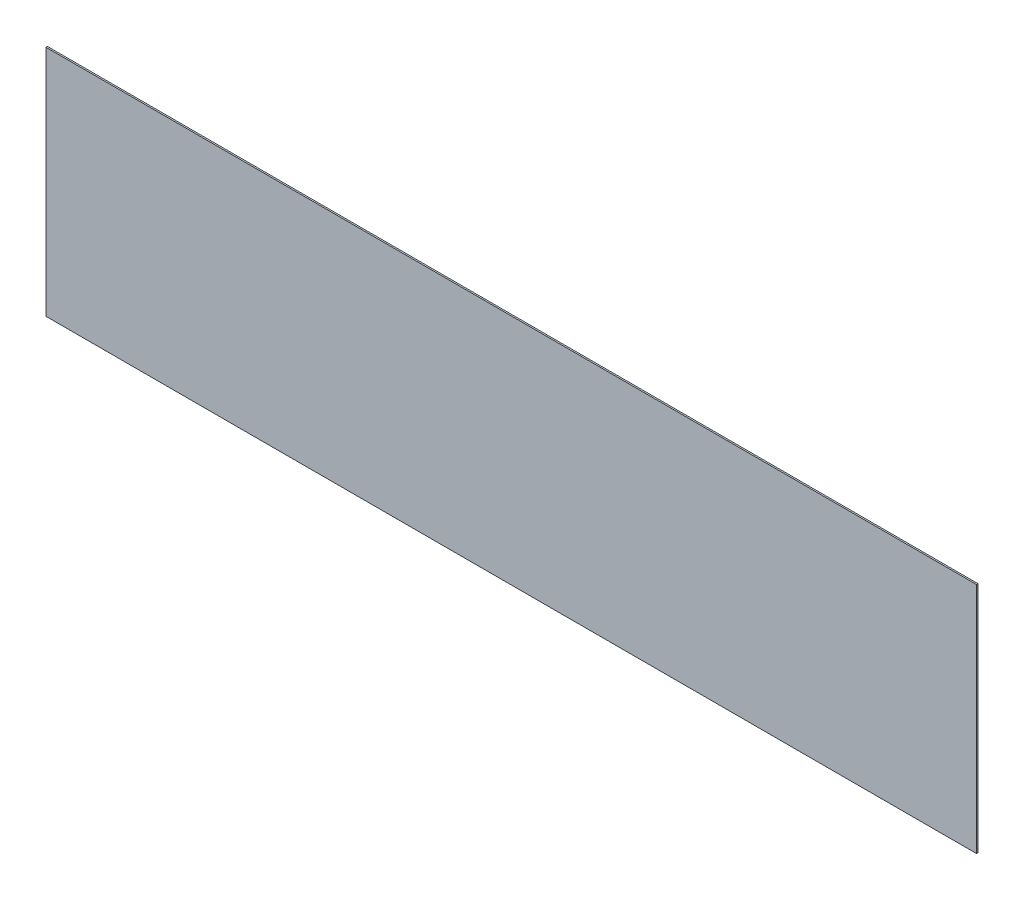
ISO-10303-21;
HEADER;
FILE_DESCRIPTION(('STEP AP214'),'2;1');
FILE_NAME('part.step','',(''),(''),'','','');
FILE_SCHEMA(('AUTOMOTIVE_DESIGN { 1 0 10303 214 1 1 1 1 }'));
ENDSEC;
DATA;
#1=APPLICATION_CONTEXT('core data for automotive mechanical design processes');
#2=APPLICATION_PROTOCOL_DEFINITION('international standard','automotive_design',2000,#1);
#3=PRODUCT_CONTEXT('',#1,'mechanical');
#4=PRODUCT('Part','Part','',(#3));
#5=PRODUCT_RELATED_PRODUCT_CATEGORY('part','',(#4));
#6=PRODUCT_DEFINITION_FORMATION('','',#4);
#7=PRODUCT_DEFINITION_CONTEXT('part definition',#1,'design');
#8=PRODUCT_DEFINITION('design','',#6,#7);
#9=PRODUCT_DEFINITION_SHAPE('','',#8);
#10=(LENGTH_UNIT() NAMED_UNIT(*) SI_UNIT(.MILLI.,.METRE.));
#11=(NAMED_UNIT(*) PLANE_ANGLE_UNIT() SI_UNIT($,.RADIAN.));
#12=(NAMED_UNIT(*) SI_UNIT($,.STERADIAN.) SOLID_ANGLE_UNIT());
#13=UNCERTAINTY_MEASURE_WITH_UNIT(LENGTH_MEASURE(1.E-05),#10,'distance_accuracy_value','');
#14=(GEOMETRIC_REPRESENTATION_CONTEXT(3) GLOBAL_UNCERTAINTY_ASSIGNED_CONTEXT((#13)) GLOBAL_UNIT_ASSIGNED_CONTEXT((#10,
#11,#12)) REPRESENTATION_CONTEXT('',''));
#15=CARTESIAN_POINT('',(0.,0.,0.));
#16=DIRECTION('',(0.,0.,1.));
#17=DIRECTION('',(1.,0.,0.));
#18=AXIS2_PLACEMENT_3D('',#15,#16,#17);
#19=CARTESIAN_POINT('',(1242.,311.,2.));
#20=DIRECTION('',(0.,-1.,0.));
#21=DIRECTION('',(1.,0.,0.));
#22=AXIS2_PLACEMENT_3D('',#19,#20,#21);
#23=PLANE('',#22);
#24=DIRECTION('',(-1.,0.,0.));
#25=VECTOR('',#24,1.);
#26=CARTESIAN_POINT('',(1242.,311.,0.));
#27=LINE('',#26,#25);
#28=CARTESIAN_POINT('',(1242.,311.,0.));
#29=VERTEX_POINT('',#28);
#30=CARTESIAN_POINT('',(0.,311.,0.));
#31=VERTEX_POINT('',#30);
#32=EDGE_CURVE('E109',#29,#31,#27,.T.);
#33=ORIENTED_EDGE('',*,*,#32,.T.);
#34=DIRECTION('',(0.,0.,-1.));
#35=VECTOR('',#34,1.);
#36=CARTESIAN_POINT('',(0.,311.,2.));
#37=LINE('',#36,#35);
#38=CARTESIAN_POINT('',(0.,311.,2.));
#39=VERTEX_POINT('',#38);
#40=EDGE_CURVE('E11',#39,#31,#37,.T.);
#41=ORIENTED_EDGE('',*,*,#40,.F.);
#42=DIRECTION('',(-1.,0.,0.));
#43=VECTOR('',#42,1.);
#44=CARTESIAN_POINT('',(1242.,311.,2.));
#45=LINE('',#44,#43);
#46=CARTESIAN_POINT('',(1242.,311.,2.));
#47=VERTEX_POINT('',#46);
#48=EDGE_CURVE('E93',#47,#39,#45,.T.);
#49=ORIENTED_EDGE('',*,*,#48,.F.);
#50=DIRECTION('',(0.,0.,-1.));
#51=VECTOR('',#50,1.);
#52=CARTESIAN_POINT('',(1242.,311.,2.));
#53=LINE('',#52,#51);
#54=EDGE_CURVE('E105',#47,#29,#53,.T.);
#55=ORIENTED_EDGE('',*,*,#54,.T.);
#56=EDGE_LOOP('',(#33,#41,#49,#55));
#57=FACE_BOUND('',#56,.T.);
#58=ADVANCED_FACE('F41',(#57),#23,.F.);
#59=CARTESIAN_POINT('',(0.,311.,2.));
#60=DIRECTION('',(1.,0.,0.));
#61=DIRECTION('',(0.,1.,0.));
#62=AXIS2_PLACEMENT_3D('',#59,#60,#61);
#63=PLANE('',#62);
#64=DIRECTION('',(0.,-1.,0.));
#65=VECTOR('',#64,1.);
#66=CARTESIAN_POINT('',(0.,311.,0.));
#67=LINE('',#66,#65);
#68=CARTESIAN_POINT('',(0.,0.,0.));
#69=VERTEX_POINT('',#68);
#70=EDGE_CURVE('E98',#31,#69,#67,.T.);
#71=ORIENTED_EDGE('',*,*,#70,.T.);
#72=DIRECTION('',(0.,0.,-1.));
#73=VECTOR('',#72,1.);
#74=CARTESIAN_POINT('',(0.,0.,2.));
#75=LINE('',#74,#73);
#76=CARTESIAN_POINT('',(0.,0.,2.));
#77=VERTEX_POINT('',#76);
#78=EDGE_CURVE('E50',#77,#69,#75,.T.);
#79=ORIENTED_EDGE('',*,*,#78,.F.);
#80=DIRECTION('',(0.,-1.,0.));
#81=VECTOR('',#80,1.);
#82=CARTESIAN_POINT('',(0.,311.,2.));
#83=LINE('',#82,#81);
#84=EDGE_CURVE('E88',#39,#77,#83,.T.);
#85=ORIENTED_EDGE('',*,*,#84,.F.);
#86=ORIENTED_EDGE('',*,*,#40,.T.);
#87=EDGE_LOOP('',(#71,#79,#85,#86));
#88=FACE_BOUND('',#87,.T.);
#89=ADVANCED_FACE('F97',(#88),#63,.F.);
#90=CARTESIAN_POINT('',(1242.,0.,2.));
#91=DIRECTION('',(0.,1.,0.));
#92=DIRECTION('',(-1.,0.,0.));
#93=AXIS2_PLACEMENT_3D('',#90,#91,#92);
#94=PLANE('',#93);
#95=DIRECTION('',(1.,0.,0.));
#96=VECTOR('',#95,1.);
#97=CARTESIAN_POINT('',(1242.,0.,0.));
#98=LINE('',#97,#96);
#99=CARTESIAN_POINT('',(1242.,0.,0.));
#100=VERTEX_POINT('',#99);
#101=EDGE_CURVE('E75',#69,#100,#98,.T.);
#102=ORIENTED_EDGE('',*,*,#101,.T.);
#103=DIRECTION('',(0.,0.,-1.));
#104=VECTOR('',#103,1.);
#105=CARTESIAN_POINT('',(1242.,0.,2.));
#106=LINE('',#105,#104);
#107=CARTESIAN_POINT('',(1242.,0.,2.));
#108=VERTEX_POINT('',#107);
#109=EDGE_CURVE('E100',#108,#100,#106,.T.);
#110=ORIENTED_EDGE('',*,*,#109,.F.);
#111=DIRECTION('',(1.,0.,0.));
#112=VECTOR('',#111,1.);
#113=CARTESIAN_POINT('',(1242.,0.,2.));
#114=LINE('',#113,#112);
#115=EDGE_CURVE('E91',#77,#108,#114,.T.);
#116=ORIENTED_EDGE('',*,*,#115,.F.);
#117=ORIENTED_EDGE('',*,*,#78,.T.);
#118=EDGE_LOOP('',(#102,#110,#116,#117));
#119=FACE_BOUND('',#118,.T.);
#120=ADVANCED_FACE('F101',(#119),#94,.F.);
#121=CARTESIAN_POINT('',(1242.,311.,2.));
#122=DIRECTION('',(-1.,0.,0.));
#123=DIRECTION('',(0.,0.,1.));
#124=AXIS2_PLACEMENT_3D('',#121,#122,#123);
#125=PLANE('',#124);
#126=DIRECTION('',(0.,1.,0.));
#127=VECTOR('',#126,1.);
#128=CARTESIAN_POINT('',(1242.,311.,0.));
#129=LINE('',#128,#127);
#130=EDGE_CURVE('E81',#100,#29,#129,.T.);
#131=ORIENTED_EDGE('',*,*,#130,.T.);
#132=ORIENTED_EDGE('',*,*,#54,.F.);
#133=DIRECTION('',(0.,1.,0.));
#134=VECTOR('',#133,1.);
#135=CARTESIAN_POINT('',(1242.,311.,2.));
#136=LINE('',#135,#134);
#137=EDGE_CURVE('E58',#108,#47,#136,.T.);
#138=ORIENTED_EDGE('',*,*,#137,.F.);
#139=ORIENTED_EDGE('',*,*,#109,.T.);
#140=EDGE_LOOP('',(#131,#132,#138,#139));
#141=FACE_BOUND('',#140,.T.);
#142=ADVANCED_FACE('F122',(#141),#125,.F.);
#143=CARTESIAN_POINT('',(0.,0.,2.));
#144=DIRECTION('',(0.,0.,1.));
#145=DIRECTION('',(1.,0.,0.));
#146=AXIS2_PLACEMENT_3D('',#143,#144,#145);
#147=PLANE('',#146);
#148=ORIENTED_EDGE('',*,*,#48,.T.);
#149=ORIENTED_EDGE('',*,*,#84,.T.);
#150=ORIENTED_EDGE('',*,*,#115,.T.);
#151=ORIENTED_EDGE('',*,*,#137,.T.);
#152=EDGE_LOOP('',(#148,#149,#150,#151));
#153=FACE_BOUND('',#152,.T.);
#154=ADVANCED_FACE('F89',(#153),#147,.T.);
#155=CARTESIAN_POINT('',(0.,0.,0.));
#156=DIRECTION('',(0.,0.,1.));
#157=DIRECTION('',(1.,0.,0.));
#158=AXIS2_PLACEMENT_3D('',#155,#156,#157);
#159=PLANE('',#158);
#160=ORIENTED_EDGE('',*,*,#32,.F.);
#161=ORIENTED_EDGE('',*,*,#130,.F.);
#162=ORIENTED_EDGE('',*,*,#101,.F.);
#163=ORIENTED_EDGE('',*,*,#70,.F.);
#164=EDGE_LOOP('',(#160,#161,#162,#163));
#165=FACE_BOUND('',#164,.T.);
#166=ADVANCED_FACE('F125',(#165),#159,.F.);
#167=CLOSED_SHELL('',(#58,#89,#120,#142,#154,#166));
#168=MANIFOLD_SOLID_BREP('B2',#167);
#169=ADVANCED_BREP_SHAPE_REPRESENTATION('',(#18,#168),#14);
#170=SHAPE_DEFINITION_REPRESENTATION(#9,#169);
ENDSEC;
END-ISO-10303-21;
